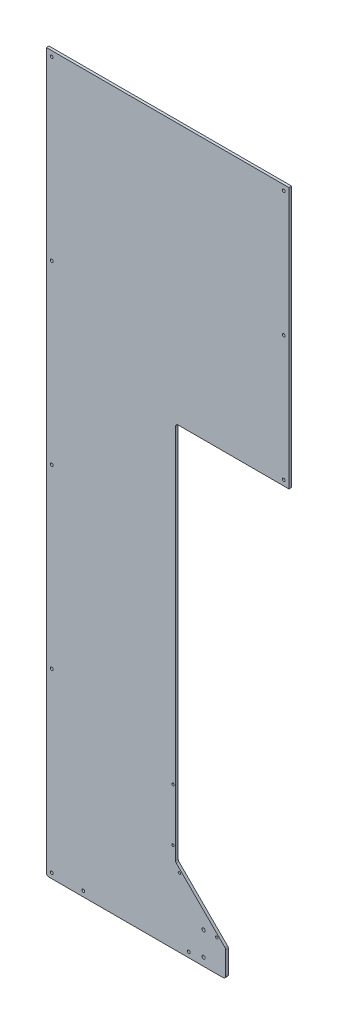
ISO-10303-21;
HEADER;
FILE_DESCRIPTION(('STEP AP214'),'2;1');
FILE_NAME('part.step','',(''),(''),'','','');
FILE_SCHEMA(('AUTOMOTIVE_DESIGN { 1 0 10303 214 1 1 1 1 }'));
ENDSEC;
DATA;
#1=APPLICATION_CONTEXT('core data for automotive mechanical design processes');
#2=APPLICATION_PROTOCOL_DEFINITION('international standard','automotive_design',2000,#1);
#3=PRODUCT_CONTEXT('',#1,'mechanical');
#4=PRODUCT('Part','Part','',(#3));
#5=PRODUCT_RELATED_PRODUCT_CATEGORY('part','',(#4));
#6=PRODUCT_DEFINITION_FORMATION('','',#4);
#7=PRODUCT_DEFINITION_CONTEXT('part definition',#1,'design');
#8=PRODUCT_DEFINITION('design','',#6,#7);
#9=PRODUCT_DEFINITION_SHAPE('','',#8);
#10=(LENGTH_UNIT() NAMED_UNIT(*) SI_UNIT(.MILLI.,.METRE.));
#11=(NAMED_UNIT(*) PLANE_ANGLE_UNIT() SI_UNIT($,.RADIAN.));
#12=(NAMED_UNIT(*) SI_UNIT($,.STERADIAN.) SOLID_ANGLE_UNIT());
#13=UNCERTAINTY_MEASURE_WITH_UNIT(LENGTH_MEASURE(1.E-05),#10,'distance_accuracy_value','');
#14=(GEOMETRIC_REPRESENTATION_CONTEXT(3) GLOBAL_UNCERTAINTY_ASSIGNED_CONTEXT((#13)) GLOBAL_UNIT_ASSIGNED_CONTEXT((#10,
#11,#12)) REPRESENTATION_CONTEXT('',''));
#15=CARTESIAN_POINT('',(0.,0.,0.));
#16=DIRECTION('',(0.,0.,1.));
#17=DIRECTION('',(1.,0.,0.));
#18=AXIS2_PLACEMENT_3D('',#15,#16,#17);
#19=CARTESIAN_POINT('',(0.,0.,6.35));
#20=DIRECTION('',(1.,0.,0.));
#21=DIRECTION('',(0.,0.,-1.));
#22=AXIS2_PLACEMENT_3D('',#19,#20,#21);
#23=PLANE('',#22);
#24=DIRECTION('',(0.,-1.,0.));
#25=VECTOR('',#24,1.);
#26=CARTESIAN_POINT('',(0.,0.,0.));
#27=LINE('',#26,#25);
#28=CARTESIAN_POINT('',(0.,1727.2,0.));
#29=VERTEX_POINT('',#28);
#30=CARTESIAN_POINT('',(0.,6.35,0.));
#31=VERTEX_POINT('',#30);
#32=EDGE_CURVE('E148',#29,#31,#27,.T.);
#33=ORIENTED_EDGE('',*,*,#32,.T.);
#34=DIRECTION('',(0.,0.,-1.));
#35=VECTOR('',#34,1.);
#36=CARTESIAN_POINT('',(0.,6.35,6.35));
#37=LINE('',#36,#35);
#38=CARTESIAN_POINT('',(0.,6.35,6.35));
#39=VERTEX_POINT('',#38);
#40=EDGE_CURVE('E182',#31,#39,#37,.F.);
#41=ORIENTED_EDGE('',*,*,#40,.T.);
#42=DIRECTION('',(0.,-1.,0.));
#43=VECTOR('',#42,1.);
#44=CARTESIAN_POINT('',(0.,0.,6.35));
#45=LINE('',#44,#43);
#46=CARTESIAN_POINT('',(0.,1727.2,6.35));
#47=VERTEX_POINT('',#46);
#48=EDGE_CURVE('E158',#47,#39,#45,.T.);
#49=ORIENTED_EDGE('',*,*,#48,.F.);
#50=DIRECTION('',(0.,0.,-1.));
#51=VECTOR('',#50,1.);
#52=CARTESIAN_POINT('',(0.,1727.2,6.35));
#53=LINE('',#52,#51);
#54=EDGE_CURVE('E164',#47,#29,#53,.T.);
#55=ORIENTED_EDGE('',*,*,#54,.T.);
#56=EDGE_LOOP('',(#33,#41,#49,#55));
#57=FACE_BOUND('',#56,.T.);
#58=ADVANCED_FACE('F35',(#57),#23,.F.);
#59=CARTESIAN_POINT('',(0.,0.,6.35));
#60=DIRECTION('',(0.,1.,0.));
#61=DIRECTION('',(0.,0.,1.));
#62=AXIS2_PLACEMENT_3D('',#59,#60,#61);
#63=PLANE('',#62);
#64=DIRECTION('',(1.,0.,0.));
#65=VECTOR('',#64,1.);
#66=CARTESIAN_POINT('',(0.,0.,6.35));
#67=LINE('',#66,#65);
#68=CARTESIAN_POINT('',(6.35,0.,6.35));
#69=VERTEX_POINT('',#68);
#70=CARTESIAN_POINT('',(425.45,0.,6.35));
#71=VERTEX_POINT('',#70);
#72=EDGE_CURVE('E292',#69,#71,#67,.T.);
#73=ORIENTED_EDGE('',*,*,#72,.F.);
#74=DIRECTION('',(0.,0.,-1.));
#75=VECTOR('',#74,1.);
#76=CARTESIAN_POINT('',(6.35,0.,6.35));
#77=LINE('',#76,#75);
#78=CARTESIAN_POINT('',(6.35,0.,0.));
#79=VERTEX_POINT('',#78);
#80=EDGE_CURVE('E173',#69,#79,#77,.T.);
#81=ORIENTED_EDGE('',*,*,#80,.T.);
#82=DIRECTION('',(1.,0.,0.));
#83=VECTOR('',#82,1.);
#84=CARTESIAN_POINT('',(0.,0.,0.));
#85=LINE('',#84,#83);
#86=CARTESIAN_POINT('',(425.45,0.,0.));
#87=VERTEX_POINT('',#86);
#88=EDGE_CURVE('E156',#79,#87,#85,.T.);
#89=ORIENTED_EDGE('',*,*,#88,.T.);
#90=DIRECTION('',(0.,0.,1.));
#91=VECTOR('',#90,1.);
#92=CARTESIAN_POINT('',(425.45,0.,6.35));
#93=LINE('',#92,#91);
#94=EDGE_CURVE('E170',#87,#71,#93,.T.);
#95=ORIENTED_EDGE('',*,*,#94,.T.);
#96=EDGE_LOOP('',(#73,#81,#89,#95));
#97=FACE_BOUND('',#96,.T.);
#98=ADVANCED_FACE('F308',(#97),#63,.F.);
#99=CARTESIAN_POINT('',(584.2,0.,6.35));
#100=DIRECTION('',(-1.,0.,0.));
#101=DIRECTION('',(0.,0.,1.));
#102=AXIS2_PLACEMENT_3D('',#99,#100,#101);
#103=PLANE('',#102);
#104=DIRECTION('',(0.,1.,0.));
#105=VECTOR('',#104,1.);
#106=CARTESIAN_POINT('',(584.2,0.,6.35));
#107=LINE('',#106,#105);
#108=CARTESIAN_POINT('',(584.2,1098.55,6.35));
#109=VERTEX_POINT('',#108);
#110=CARTESIAN_POINT('',(584.2,1727.2,6.35));
#111=VERTEX_POINT('',#110);
#112=EDGE_CURVE('E147',#109,#111,#107,.T.);
#113=ORIENTED_EDGE('',*,*,#112,.F.);
#114=DIRECTION('',(0.,0.,1.));
#115=VECTOR('',#114,1.);
#116=CARTESIAN_POINT('',(584.2,1098.55,0.));
#117=LINE('',#116,#115);
#118=CARTESIAN_POINT('',(584.2,1098.55,0.));
#119=VERTEX_POINT('',#118);
#120=EDGE_CURVE('E132',#119,#109,#117,.T.);
#121=ORIENTED_EDGE('',*,*,#120,.F.);
#122=DIRECTION('',(0.,1.,0.));
#123=VECTOR('',#122,1.);
#124=CARTESIAN_POINT('',(584.2,0.,0.));
#125=LINE('',#124,#123);
#126=CARTESIAN_POINT('',(584.2,1727.2,0.));
#127=VERTEX_POINT('',#126);
#128=EDGE_CURVE('E145',#119,#127,#125,.T.);
#129=ORIENTED_EDGE('',*,*,#128,.T.);
#130=DIRECTION('',(0.,0.,-1.));
#131=VECTOR('',#130,1.);
#132=CARTESIAN_POINT('',(584.2,1727.2,6.35));
#133=LINE('',#132,#131);
#134=EDGE_CURVE('E167',#111,#127,#133,.T.);
#135=ORIENTED_EDGE('',*,*,#134,.F.);
#136=EDGE_LOOP('',(#113,#121,#129,#135));
#137=FACE_BOUND('',#136,.T.);
#138=ADVANCED_FACE('F143',(#137),#103,.F.);
#139=CARTESIAN_POINT('',(0.,1727.2,6.35));
#140=DIRECTION('',(0.,-1.,0.));
#141=DIRECTION('',(0.,0.,-1.));
#142=AXIS2_PLACEMENT_3D('',#139,#140,#141);
#143=PLANE('',#142);
#144=DIRECTION('',(-1.,0.,0.));
#145=VECTOR('',#144,1.);
#146=CARTESIAN_POINT('',(0.,1727.2,0.));
#147=LINE('',#146,#145);
#148=EDGE_CURVE('E155',#127,#29,#147,.T.);
#149=ORIENTED_EDGE('',*,*,#148,.T.);
#150=ORIENTED_EDGE('',*,*,#54,.F.);
#151=DIRECTION('',(-1.,0.,0.));
#152=VECTOR('',#151,1.);
#153=CARTESIAN_POINT('',(0.,1727.2,6.35));
#154=LINE('',#153,#152);
#155=EDGE_CURVE('E168',#111,#47,#154,.T.);
#156=ORIENTED_EDGE('',*,*,#155,.F.);
#157=ORIENTED_EDGE('',*,*,#134,.T.);
#158=EDGE_LOOP('',(#149,#150,#156,#157));
#159=FACE_BOUND('',#158,.T.);
#160=ADVANCED_FACE('F477',(#159),#143,.F.);
#161=CARTESIAN_POINT('',(0.,0.,6.35));
#162=DIRECTION('',(0.,0.,-1.));
#163=DIRECTION('',(-1.,0.,0.));
#164=AXIS2_PLACEMENT_3D('',#161,#162,#163);
#165=PLANE('',#164);
#166=CARTESIAN_POINT('',(378.46762,19.0499999999997,6.35));
#167=DIRECTION('',(0.,0.,1.));
#168=DIRECTION('',(1.,0.,0.));
#169=AXIS2_PLACEMENT_3D('',#166,#167,#168);
#170=CIRCLE('',#169,3.937);
#171=CARTESIAN_POINT('',(382.40462,19.0499999999997,6.35));
#172=VERTEX_POINT('',#171);
#173=EDGE_CURVE('E704',#172,#172,#170,.T.);
#174=ORIENTED_EDGE('',*,*,#173,.F.);
#175=EDGE_LOOP('',(#174));
#176=FACE_BOUND('',#175,.T.);
#177=CARTESIAN_POINT('',(378.46762,76.1999999999997,6.35));
#178=DIRECTION('',(0.,0.,1.));
#179=DIRECTION('',(1.,0.,0.));
#180=AXIS2_PLACEMENT_3D('',#177,#178,#179);
#181=CIRCLE('',#180,3.937);
#182=CARTESIAN_POINT('',(382.40462,76.1999999999997,6.35));
#183=VERTEX_POINT('',#182);
#184=EDGE_CURVE('E710',#183,#183,#181,.T.);
#185=ORIENTED_EDGE('',*,*,#184,.F.);
#186=EDGE_LOOP('',(#185));
#187=FACE_BOUND('',#186,.T.);
#188=CARTESIAN_POINT('',(304.8,342.9,6.35));
#189=DIRECTION('',(0.,0.,-1.));
#190=DIRECTION('',(-1.,0.,0.));
#191=AXIS2_PLACEMENT_3D('',#188,#189,#190);
#192=CIRCLE('',#191,2.8067);
#193=CARTESIAN_POINT('',(301.9933,342.9,6.35));
#194=VERTEX_POINT('',#193);
#195=EDGE_CURVE('E720',#194,#194,#192,.T.);
#196=ORIENTED_EDGE('',*,*,#195,.T.);
#197=EDGE_LOOP('',(#196));
#198=FACE_BOUND('',#197,.T.);
#199=CARTESIAN_POINT('',(304.8,215.9,6.35));
#200=DIRECTION('',(0.,0.,-1.));
#201=DIRECTION('',(-1.,0.,0.));
#202=AXIS2_PLACEMENT_3D('',#199,#200,#201);
#203=CIRCLE('',#202,2.8067);
#204=CARTESIAN_POINT('',(301.9933,215.9,6.35));
#205=VERTEX_POINT('',#204);
#206=EDGE_CURVE('E729',#205,#205,#203,.T.);
#207=ORIENTED_EDGE('',*,*,#206,.T.);
#208=EDGE_LOOP('',(#207));
#209=FACE_BOUND('',#208,.T.);
#210=CARTESIAN_POINT('',(320.317182668239,166.002561210692,6.35));
#211=DIRECTION('',(0.,0.,-1.));
#212=DIRECTION('',(-1.,0.,0.));
#213=AXIS2_PLACEMENT_3D('',#210,#211,#212);
#214=CIRCLE('',#213,2.8067);
#215=CARTESIAN_POINT('',(317.510482668239,166.002561210692,6.35));
#216=VERTEX_POINT('',#215);
#217=EDGE_CURVE('E738',#216,#216,#214,.T.);
#218=ORIENTED_EDGE('',*,*,#217,.T.);
#219=EDGE_LOOP('',(#218));
#220=FACE_BOUND('',#219,.T.);
#221=CARTESIAN_POINT('',(410.11974387893,76.2,6.35));
#222=DIRECTION('',(0.,0.,-1.));
#223=DIRECTION('',(-1.,0.,0.));
#224=AXIS2_PLACEMENT_3D('',#221,#222,#223);
#225=CIRCLE('',#224,2.8067);
#226=CARTESIAN_POINT('',(407.31304387893,76.2,6.35));
#227=VERTEX_POINT('',#226);
#228=EDGE_CURVE('E222',#227,#227,#225,.T.);
#229=ORIENTED_EDGE('',*,*,#228,.T.);
#230=EDGE_LOOP('',(#229));
#231=FACE_BOUND('',#230,.T.);
#232=CARTESIAN_POINT('',(88.9,12.7,6.35));
#233=DIRECTION('',(0.,0.,1.));
#234=DIRECTION('',(1.,0.,0.));
#235=AXIS2_PLACEMENT_3D('',#232,#233,#234);
#236=CIRCLE('',#235,3.37819999999999);
#237=CARTESIAN_POINT('',(92.2782,12.7,6.35));
#238=VERTEX_POINT('',#237);
#239=EDGE_CURVE('E211',#238,#238,#236,.T.);
#240=ORIENTED_EDGE('',*,*,#239,.F.);
#241=EDGE_LOOP('',(#240));
#242=FACE_BOUND('',#241,.T.);
#243=CARTESIAN_POINT('',(342.9,12.7,6.35));
#244=DIRECTION('',(0.,0.,1.));
#245=DIRECTION('',(1.,0.,0.));
#246=AXIS2_PLACEMENT_3D('',#243,#244,#245);
#247=CIRCLE('',#246,3.37819999999999);
#248=CARTESIAN_POINT('',(346.2782,12.7,6.35));
#249=VERTEX_POINT('',#248);
#250=EDGE_CURVE('E217',#249,#249,#247,.T.);
#251=ORIENTED_EDGE('',*,*,#250,.F.);
#252=EDGE_LOOP('',(#251));
#253=FACE_BOUND('',#252,.T.);
#254=CARTESIAN_POINT('',(12.7,1714.5,6.35));
#255=DIRECTION('',(0.,0.,1.));
#256=DIRECTION('',(1.,0.,0.));
#257=AXIS2_PLACEMENT_3D('',#254,#255,#256);
#258=CIRCLE('',#257,3.37819999999999);
#259=CARTESIAN_POINT('',(16.0782,1714.5,6.35));
#260=VERTEX_POINT('',#259);
#261=EDGE_CURVE('E215',#260,#260,#258,.T.);
#262=ORIENTED_EDGE('',*,*,#261,.F.);
#263=EDGE_LOOP('',(#262));
#264=FACE_BOUND('',#263,.T.);
#265=CARTESIAN_POINT('',(12.7,1289.05,6.35));
#266=DIRECTION('',(0.,0.,1.));
#267=DIRECTION('',(1.,0.,0.));
#268=AXIS2_PLACEMENT_3D('',#265,#266,#267);
#269=CIRCLE('',#268,3.37819999999999);
#270=CARTESIAN_POINT('',(16.0782,1289.05,6.35));
#271=VERTEX_POINT('',#270);
#272=EDGE_CURVE('E232',#271,#271,#269,.T.);
#273=ORIENTED_EDGE('',*,*,#272,.F.);
#274=EDGE_LOOP('',(#273));
#275=FACE_BOUND('',#274,.T.);
#276=CARTESIAN_POINT('',(12.7,863.6,6.35));
#277=DIRECTION('',(0.,0.,1.));
#278=DIRECTION('',(1.,0.,0.));
#279=AXIS2_PLACEMENT_3D('',#276,#277,#278);
#280=CIRCLE('',#279,3.37819999999999);
#281=CARTESIAN_POINT('',(16.0782,863.6,6.35));
#282=VERTEX_POINT('',#281);
#283=EDGE_CURVE('E238',#282,#282,#280,.T.);
#284=ORIENTED_EDGE('',*,*,#283,.F.);
#285=EDGE_LOOP('',(#284));
#286=FACE_BOUND('',#285,.T.);
#287=CARTESIAN_POINT('',(12.7,438.15,6.35));
#288=DIRECTION('',(0.,0.,1.));
#289=DIRECTION('',(1.,0.,0.));
#290=AXIS2_PLACEMENT_3D('',#287,#288,#289);
#291=CIRCLE('',#290,3.37819999999999);
#292=CARTESIAN_POINT('',(16.0782,438.15,6.35));
#293=VERTEX_POINT('',#292);
#294=EDGE_CURVE('E244',#293,#293,#291,.T.);
#295=ORIENTED_EDGE('',*,*,#294,.F.);
#296=EDGE_LOOP('',(#295));
#297=FACE_BOUND('',#296,.T.);
#298=CARTESIAN_POINT('',(12.7,12.7,6.35));
#299=DIRECTION('',(0.,0.,1.));
#300=DIRECTION('',(1.,0.,0.));
#301=AXIS2_PLACEMENT_3D('',#298,#299,#300);
#302=CIRCLE('',#301,3.37819999999999);
#303=CARTESIAN_POINT('',(16.0782,12.7,6.35));
#304=VERTEX_POINT('',#303);
#305=EDGE_CURVE('E250',#304,#304,#302,.T.);
#306=ORIENTED_EDGE('',*,*,#305,.F.);
#307=EDGE_LOOP('',(#306));
#308=FACE_BOUND('',#307,.T.);
#309=CARTESIAN_POINT('',(571.5,1111.25,6.35));
#310=DIRECTION('',(0.,0.,1.));
#311=DIRECTION('',(1.,0.,0.));
#312=AXIS2_PLACEMENT_3D('',#309,#310,#311);
#313=CIRCLE('',#312,3.3782);
#314=CARTESIAN_POINT('',(574.8782,1111.25,6.35));
#315=VERTEX_POINT('',#314);
#316=EDGE_CURVE('E256',#315,#315,#313,.T.);
#317=ORIENTED_EDGE('',*,*,#316,.F.);
#318=EDGE_LOOP('',(#317));
#319=FACE_BOUND('',#318,.T.);
#320=CARTESIAN_POINT('',(571.5,1412.875,6.35));
#321=DIRECTION('',(0.,0.,1.));
#322=DIRECTION('',(1.,0.,0.));
#323=AXIS2_PLACEMENT_3D('',#320,#321,#322);
#324=CIRCLE('',#323,3.3782);
#325=CARTESIAN_POINT('',(574.8782,1412.875,6.35));
#326=VERTEX_POINT('',#325);
#327=EDGE_CURVE('E262',#326,#326,#324,.T.);
#328=ORIENTED_EDGE('',*,*,#327,.F.);
#329=EDGE_LOOP('',(#328));
#330=FACE_BOUND('',#329,.T.);
#331=CARTESIAN_POINT('',(571.5,1714.5,6.35));
#332=DIRECTION('',(0.,0.,1.));
#333=DIRECTION('',(1.,0.,0.));
#334=AXIS2_PLACEMENT_3D('',#331,#332,#333);
#335=CIRCLE('',#334,3.3782);
#336=CARTESIAN_POINT('',(574.8782,1714.5,6.35));
#337=VERTEX_POINT('',#336);
#338=EDGE_CURVE('E268',#337,#337,#335,.T.);
#339=ORIENTED_EDGE('',*,*,#338,.F.);
#340=EDGE_LOOP('',(#339));
#341=FACE_BOUND('',#340,.T.);
#342=ORIENTED_EDGE('',*,*,#48,.T.);
#343=CARTESIAN_POINT('',(6.35,6.35,6.35));
#344=DIRECTION('',(0.,0.,-1.));
#345=DIRECTION('',(-1.,0.,0.));
#346=AXIS2_PLACEMENT_3D('',#343,#344,#345);
#347=CIRCLE('',#346,6.35);
#348=EDGE_CURVE('E188',#39,#69,#347,.F.);
#349=ORIENTED_EDGE('',*,*,#348,.T.);
#350=ORIENTED_EDGE('',*,*,#72,.T.);
#351=CARTESIAN_POINT('',(425.45,6.35,6.35));
#352=DIRECTION('',(0.,0.,-1.));
#353=DIRECTION('',(-1.,0.,0.));
#354=AXIS2_PLACEMENT_3D('',#351,#352,#353);
#355=CIRCLE('',#354,6.35);
#356=CARTESIAN_POINT('',(431.8,6.35,6.35));
#357=VERTEX_POINT('',#356);
#358=EDGE_CURVE('E186',#71,#357,#355,.F.);
#359=ORIENTED_EDGE('',*,*,#358,.T.);
#360=DIRECTION('',(0.,-1.,0.));
#361=VECTOR('',#360,1.);
#362=CARTESIAN_POINT('',(431.8,63.5,6.35));
#363=LINE('',#362,#361);
#364=CARTESIAN_POINT('',(431.8,60.8697438789308,6.35));
#365=VERTEX_POINT('',#364);
#366=EDGE_CURVE('E139',#365,#357,#363,.T.);
#367=ORIENTED_EDGE('',*,*,#366,.F.);
#368=CARTESIAN_POINT('',(425.45,60.8697438789308,6.35));
#369=DIRECTION('',(0.,0.,-1.));
#370=DIRECTION('',(-1.,0.,0.));
#371=AXIS2_PLACEMENT_3D('',#368,#369,#370);
#372=CIRCLE('',#371,6.35);
#373=CARTESIAN_POINT('',(429.940128060535,65.3598719394654,6.35));
#374=VERTEX_POINT('',#373);
#375=EDGE_CURVE('E184',#365,#374,#372,.F.);
#376=ORIENTED_EDGE('',*,*,#375,.T.);
#377=DIRECTION('',(0.70710678118655,-0.707106781186545,0.));
#378=VECTOR('',#377,1.);
#379=CARTESIAN_POINT('',(311.15,184.149999999999,6.35));
#380=LINE('',#379,#378);
#381=CARTESIAN_POINT('',(313.009871939466,182.290128060534,6.35));
#382=VERTEX_POINT('',#381);
#383=EDGE_CURVE('E285',#382,#374,#380,.T.);
#384=ORIENTED_EDGE('',*,*,#383,.F.);
#385=CARTESIAN_POINT('',(317.5,186.780256121068,6.35));
#386=DIRECTION('',(0.,0.,-1.));
#387=DIRECTION('',(-1.,0.,0.));
#388=AXIS2_PLACEMENT_3D('',#385,#386,#387);
#389=CIRCLE('',#388,6.35);
#390=CARTESIAN_POINT('',(311.15,186.780256121068,6.35));
#391=VERTEX_POINT('',#390);
#392=EDGE_CURVE('E57',#382,#391,#389,.T.);
#393=ORIENTED_EDGE('',*,*,#392,.T.);
#394=DIRECTION('',(0.,-1.,0.));
#395=VECTOR('',#394,1.);
#396=CARTESIAN_POINT('',(311.15,1098.55,6.35));
#397=LINE('',#396,#395);
#398=CARTESIAN_POINT('',(311.15,1092.2,6.35));
#399=VERTEX_POINT('',#398);
#400=EDGE_CURVE('E283',#399,#391,#397,.T.);
#401=ORIENTED_EDGE('',*,*,#400,.F.);
#402=CARTESIAN_POINT('',(317.5,1092.2,6.35));
#403=DIRECTION('',(0.,0.,-1.));
#404=DIRECTION('',(-1.,0.,0.));
#405=AXIS2_PLACEMENT_3D('',#402,#403,#404);
#406=CIRCLE('',#405,6.35);
#407=CARTESIAN_POINT('',(317.5,1098.55,6.35));
#408=VERTEX_POINT('',#407);
#409=EDGE_CURVE('E44',#399,#408,#406,.T.);
#410=ORIENTED_EDGE('',*,*,#409,.T.);
#411=DIRECTION('',(-1.,0.,0.));
#412=VECTOR('',#411,1.);
#413=CARTESIAN_POINT('',(584.2,1098.55,6.35));
#414=LINE('',#413,#412);
#415=EDGE_CURVE('E273',#109,#408,#414,.T.);
#416=ORIENTED_EDGE('',*,*,#415,.F.);
#417=ORIENTED_EDGE('',*,*,#112,.T.);
#418=ORIENTED_EDGE('',*,*,#155,.T.);
#419=EDGE_LOOP('',(#342,#349,#350,#359,#367,#376,#384,#393,#401,#410,#416,#417,#418));
#420=FACE_BOUND('',#419,.T.);
#421=ADVANCED_FACE('F306',(#176,#187,#198,#209,#220,#231,#242,#253,#264,#275,#286,#297,#308,
#319,#330,#341,#420),#165,.F.);
#422=CARTESIAN_POINT('',(0.,0.,0.));
#423=DIRECTION('',(0.,0.,-1.));
#424=DIRECTION('',(-1.,0.,0.));
#425=AXIS2_PLACEMENT_3D('',#422,#423,#424);
#426=PLANE('',#425);
#427=CARTESIAN_POINT('',(378.46762,19.0499999999997,0.));
#428=DIRECTION('',(0.,0.,1.));
#429=DIRECTION('',(1.,0.,0.));
#430=AXIS2_PLACEMENT_3D('',#427,#428,#429);
#431=CIRCLE('',#430,3.937);
#432=CARTESIAN_POINT('',(382.40462,19.0499999999997,0.));
#433=VERTEX_POINT('',#432);
#434=EDGE_CURVE('E701',#433,#433,#431,.T.);
#435=ORIENTED_EDGE('',*,*,#434,.T.);
#436=EDGE_LOOP('',(#435));
#437=FACE_BOUND('',#436,.T.);
#438=CARTESIAN_POINT('',(378.46762,76.1999999999997,0.));
#439=DIRECTION('',(0.,0.,1.));
#440=DIRECTION('',(1.,0.,0.));
#441=AXIS2_PLACEMENT_3D('',#438,#439,#440);
#442=CIRCLE('',#441,3.937);
#443=CARTESIAN_POINT('',(382.40462,76.1999999999997,0.));
#444=VERTEX_POINT('',#443);
#445=EDGE_CURVE('E705',#444,#444,#442,.T.);
#446=ORIENTED_EDGE('',*,*,#445,.T.);
#447=EDGE_LOOP('',(#446));
#448=FACE_BOUND('',#447,.T.);
#449=CARTESIAN_POINT('',(304.8,342.9,0.));
#450=DIRECTION('',(0.,0.,-1.));
#451=DIRECTION('',(-1.,0.,0.));
#452=AXIS2_PLACEMENT_3D('',#449,#450,#451);
#453=CIRCLE('',#452,4.88949999999999);
#454=CARTESIAN_POINT('',(299.9105,342.9,0.));
#455=VERTEX_POINT('',#454);
#456=EDGE_CURVE('E707',#455,#455,#453,.T.);
#457=ORIENTED_EDGE('',*,*,#456,.F.);
#458=EDGE_LOOP('',(#457));
#459=FACE_BOUND('',#458,.T.);
#460=CARTESIAN_POINT('',(304.8,215.9,0.));
#461=DIRECTION('',(0.,0.,-1.));
#462=DIRECTION('',(-1.,0.,0.));
#463=AXIS2_PLACEMENT_3D('',#460,#461,#462);
#464=CIRCLE('',#463,4.88949999999999);
#465=CARTESIAN_POINT('',(299.9105,215.9,0.));
#466=VERTEX_POINT('',#465);
#467=EDGE_CURVE('E723',#466,#466,#464,.T.);
#468=ORIENTED_EDGE('',*,*,#467,.F.);
#469=EDGE_LOOP('',(#468));
#470=FACE_BOUND('',#469,.T.);
#471=CARTESIAN_POINT('',(320.317182668239,166.002561210692,0.));
#472=DIRECTION('',(0.,0.,-1.));
#473=DIRECTION('',(-1.,0.,0.));
#474=AXIS2_PLACEMENT_3D('',#471,#472,#473);
#475=CIRCLE('',#474,4.88949999999999);
#476=CARTESIAN_POINT('',(315.427682668239,166.002561210692,0.));
#477=VERTEX_POINT('',#476);
#478=EDGE_CURVE('E732',#477,#477,#475,.T.);
#479=ORIENTED_EDGE('',*,*,#478,.F.);
#480=EDGE_LOOP('',(#479));
#481=FACE_BOUND('',#480,.T.);
#482=CARTESIAN_POINT('',(410.11974387893,76.2,0.));
#483=DIRECTION('',(0.,0.,-1.));
#484=DIRECTION('',(-1.,0.,0.));
#485=AXIS2_PLACEMENT_3D('',#482,#483,#484);
#486=CIRCLE('',#485,4.88949999999999);
#487=CARTESIAN_POINT('',(405.23024387893,76.2,0.));
#488=VERTEX_POINT('',#487);
#489=EDGE_CURVE('E741',#488,#488,#486,.T.);
#490=ORIENTED_EDGE('',*,*,#489,.F.);
#491=EDGE_LOOP('',(#490));
#492=FACE_BOUND('',#491,.T.);
#493=CARTESIAN_POINT('',(88.9,12.7,0.));
#494=DIRECTION('',(0.,0.,-1.));
#495=DIRECTION('',(-1.,0.,0.));
#496=AXIS2_PLACEMENT_3D('',#493,#494,#495);
#497=CIRCLE('',#496,3.37819999999999);
#498=CARTESIAN_POINT('',(85.5218,12.7,0.));
#499=VERTEX_POINT('',#498);
#500=EDGE_CURVE('E39',#499,#499,#497,.T.);
#501=ORIENTED_EDGE('',*,*,#500,.F.);
#502=EDGE_LOOP('',(#501));
#503=FACE_BOUND('',#502,.T.);
#504=CARTESIAN_POINT('',(342.9,12.7,0.));
#505=DIRECTION('',(0.,0.,-1.));
#506=DIRECTION('',(-1.,0.,0.));
#507=AXIS2_PLACEMENT_3D('',#504,#505,#506);
#508=CIRCLE('',#507,3.37819999999999);
#509=CARTESIAN_POINT('',(339.5218,12.7,0.));
#510=VERTEX_POINT('',#509);
#511=EDGE_CURVE('E209',#510,#510,#508,.T.);
#512=ORIENTED_EDGE('',*,*,#511,.F.);
#513=EDGE_LOOP('',(#512));
#514=FACE_BOUND('',#513,.T.);
#515=CARTESIAN_POINT('',(12.7,1714.5,0.));
#516=DIRECTION('',(0.,0.,1.));
#517=DIRECTION('',(1.,0.,0.));
#518=AXIS2_PLACEMENT_3D('',#515,#516,#517);
#519=CIRCLE('',#518,3.37819999999999);
#520=CARTESIAN_POINT('',(16.0782,1714.5,0.));
#521=VERTEX_POINT('',#520);
#522=EDGE_CURVE('E229',#521,#521,#519,.T.);
#523=ORIENTED_EDGE('',*,*,#522,.T.);
#524=EDGE_LOOP('',(#523));
#525=FACE_BOUND('',#524,.T.);
#526=CARTESIAN_POINT('',(12.7,1289.05,0.));
#527=DIRECTION('',(0.,0.,1.));
#528=DIRECTION('',(1.,0.,0.));
#529=AXIS2_PLACEMENT_3D('',#526,#527,#528);
#530=CIRCLE('',#529,3.37819999999999);
#531=CARTESIAN_POINT('',(16.0782,1289.05,0.));
#532=VERTEX_POINT('',#531);
#533=EDGE_CURVE('E235',#532,#532,#530,.T.);
#534=ORIENTED_EDGE('',*,*,#533,.T.);
#535=EDGE_LOOP('',(#534));
#536=FACE_BOUND('',#535,.T.);
#537=CARTESIAN_POINT('',(12.7,863.6,0.));
#538=DIRECTION('',(0.,0.,1.));
#539=DIRECTION('',(1.,0.,0.));
#540=AXIS2_PLACEMENT_3D('',#537,#538,#539);
#541=CIRCLE('',#540,3.37819999999999);
#542=CARTESIAN_POINT('',(16.0782,863.6,0.));
#543=VERTEX_POINT('',#542);
#544=EDGE_CURVE('E241',#543,#543,#541,.T.);
#545=ORIENTED_EDGE('',*,*,#544,.T.);
#546=EDGE_LOOP('',(#545));
#547=FACE_BOUND('',#546,.T.);
#548=CARTESIAN_POINT('',(12.7,438.15,0.));
#549=DIRECTION('',(0.,0.,1.));
#550=DIRECTION('',(1.,0.,0.));
#551=AXIS2_PLACEMENT_3D('',#548,#549,#550);
#552=CIRCLE('',#551,3.37819999999999);
#553=CARTESIAN_POINT('',(16.0782,438.15,0.));
#554=VERTEX_POINT('',#553);
#555=EDGE_CURVE('E247',#554,#554,#552,.T.);
#556=ORIENTED_EDGE('',*,*,#555,.T.);
#557=EDGE_LOOP('',(#556));
#558=FACE_BOUND('',#557,.T.);
#559=CARTESIAN_POINT('',(12.7,12.7,0.));
#560=DIRECTION('',(0.,0.,1.));
#561=DIRECTION('',(1.,0.,0.));
#562=AXIS2_PLACEMENT_3D('',#559,#560,#561);
#563=CIRCLE('',#562,3.37819999999999);
#564=CARTESIAN_POINT('',(16.0782,12.7,0.));
#565=VERTEX_POINT('',#564);
#566=EDGE_CURVE('E253',#565,#565,#563,.T.);
#567=ORIENTED_EDGE('',*,*,#566,.T.);
#568=EDGE_LOOP('',(#567));
#569=FACE_BOUND('',#568,.T.);
#570=CARTESIAN_POINT('',(571.5,1111.25,0.));
#571=DIRECTION('',(0.,0.,1.));
#572=DIRECTION('',(1.,0.,0.));
#573=AXIS2_PLACEMENT_3D('',#570,#571,#572);
#574=CIRCLE('',#573,3.3782);
#575=CARTESIAN_POINT('',(574.8782,1111.25,0.));
#576=VERTEX_POINT('',#575);
#577=EDGE_CURVE('E259',#576,#576,#574,.T.);
#578=ORIENTED_EDGE('',*,*,#577,.T.);
#579=EDGE_LOOP('',(#578));
#580=FACE_BOUND('',#579,.T.);
#581=CARTESIAN_POINT('',(571.5,1412.875,0.));
#582=DIRECTION('',(0.,0.,1.));
#583=DIRECTION('',(1.,0.,0.));
#584=AXIS2_PLACEMENT_3D('',#581,#582,#583);
#585=CIRCLE('',#584,3.3782);
#586=CARTESIAN_POINT('',(574.8782,1412.875,0.));
#587=VERTEX_POINT('',#586);
#588=EDGE_CURVE('E265',#587,#587,#585,.T.);
#589=ORIENTED_EDGE('',*,*,#588,.T.);
#590=EDGE_LOOP('',(#589));
#591=FACE_BOUND('',#590,.T.);
#592=CARTESIAN_POINT('',(571.5,1714.5,0.));
#593=DIRECTION('',(0.,0.,1.));
#594=DIRECTION('',(1.,0.,0.));
#595=AXIS2_PLACEMENT_3D('',#592,#593,#594);
#596=CIRCLE('',#595,3.3782);
#597=CARTESIAN_POINT('',(574.8782,1714.5,0.));
#598=VERTEX_POINT('',#597);
#599=EDGE_CURVE('E271',#598,#598,#596,.T.);
#600=ORIENTED_EDGE('',*,*,#599,.T.);
#601=EDGE_LOOP('',(#600));
#602=FACE_BOUND('',#601,.T.);
#603=ORIENTED_EDGE('',*,*,#88,.F.);
#604=CARTESIAN_POINT('',(6.35,6.35,0.));
#605=DIRECTION('',(0.,0.,-1.));
#606=DIRECTION('',(-1.,0.,0.));
#607=AXIS2_PLACEMENT_3D('',#604,#605,#606);
#608=CIRCLE('',#607,6.35);
#609=EDGE_CURVE('E180',#79,#31,#608,.T.);
#610=ORIENTED_EDGE('',*,*,#609,.T.);
#611=ORIENTED_EDGE('',*,*,#32,.F.);
#612=ORIENTED_EDGE('',*,*,#148,.F.);
#613=ORIENTED_EDGE('',*,*,#128,.F.);
#614=DIRECTION('',(-1.,0.,0.));
#615=VECTOR('',#614,1.);
#616=CARTESIAN_POINT('',(584.2,1098.55,0.));
#617=LINE('',#616,#615);
#618=CARTESIAN_POINT('',(317.5,1098.55,0.));
#619=VERTEX_POINT('',#618);
#620=EDGE_CURVE('E129',#119,#619,#617,.T.);
#621=ORIENTED_EDGE('',*,*,#620,.T.);
#622=CARTESIAN_POINT('',(317.5,1092.2,0.));
#623=DIRECTION('',(0.,0.,-1.));
#624=DIRECTION('',(-1.,0.,0.));
#625=AXIS2_PLACEMENT_3D('',#622,#623,#624);
#626=CIRCLE('',#625,6.35);
#627=CARTESIAN_POINT('',(311.15,1092.2,0.));
#628=VERTEX_POINT('',#627);
#629=EDGE_CURVE('E11',#619,#628,#626,.F.);
#630=ORIENTED_EDGE('',*,*,#629,.T.);
#631=DIRECTION('',(0.,-1.,0.));
#632=VECTOR('',#631,1.);
#633=CARTESIAN_POINT('',(311.15,1098.55,0.));
#634=LINE('',#633,#632);
#635=CARTESIAN_POINT('',(311.15,186.780256121068,0.));
#636=VERTEX_POINT('',#635);
#637=EDGE_CURVE('E138',#628,#636,#634,.T.);
#638=ORIENTED_EDGE('',*,*,#637,.T.);
#639=CARTESIAN_POINT('',(317.5,186.780256121068,0.));
#640=DIRECTION('',(0.,0.,-1.));
#641=DIRECTION('',(-1.,0.,0.));
#642=AXIS2_PLACEMENT_3D('',#639,#640,#641);
#643=CIRCLE('',#642,6.35);
#644=CARTESIAN_POINT('',(313.009871939466,182.290128060534,0.));
#645=VERTEX_POINT('',#644);
#646=EDGE_CURVE('E207',#636,#645,#643,.F.);
#647=ORIENTED_EDGE('',*,*,#646,.T.);
#648=DIRECTION('',(0.70710678118655,-0.707106781186545,0.));
#649=VECTOR('',#648,1.);
#650=CARTESIAN_POINT('',(311.15,184.149999999999,0.));
#651=LINE('',#650,#649);
#652=CARTESIAN_POINT('',(429.940128060535,65.3598719394654,0.));
#653=VERTEX_POINT('',#652);
#654=EDGE_CURVE('E277',#645,#653,#651,.T.);
#655=ORIENTED_EDGE('',*,*,#654,.T.);
#656=CARTESIAN_POINT('',(425.45,60.8697438789308,0.));
#657=DIRECTION('',(0.,0.,-1.));
#658=DIRECTION('',(-1.,0.,0.));
#659=AXIS2_PLACEMENT_3D('',#656,#657,#658);
#660=CIRCLE('',#659,6.35);
#661=CARTESIAN_POINT('',(431.8,60.8697438789308,0.));
#662=VERTEX_POINT('',#661);
#663=EDGE_CURVE('E176',#653,#662,#660,.T.);
#664=ORIENTED_EDGE('',*,*,#663,.T.);
#665=DIRECTION('',(0.,-1.,0.));
#666=VECTOR('',#665,1.);
#667=CARTESIAN_POINT('',(431.8,63.5,0.));
#668=LINE('',#667,#666);
#669=CARTESIAN_POINT('',(431.8,6.35,0.));
#670=VERTEX_POINT('',#669);
#671=EDGE_CURVE('E149',#662,#670,#668,.T.);
#672=ORIENTED_EDGE('',*,*,#671,.T.);
#673=CARTESIAN_POINT('',(425.45,6.35,0.));
#674=DIRECTION('',(0.,0.,-1.));
#675=DIRECTION('',(-1.,0.,0.));
#676=AXIS2_PLACEMENT_3D('',#673,#674,#675);
#677=CIRCLE('',#676,6.35);
#678=EDGE_CURVE('E178',#670,#87,#677,.T.);
#679=ORIENTED_EDGE('',*,*,#678,.T.);
#680=EDGE_LOOP('',(#603,#610,#611,#612,#613,#621,#630,#638,#647,#655,#664,#672,#679));
#681=FACE_BOUND('',#680,.T.);
#682=ADVANCED_FACE('F153',(#437,#448,#459,#470,#481,#492,#503,#514,#525,#536,#547,#558,#569,
#580,#591,#602,#681),#426,.T.);
#683=CARTESIAN_POINT('',(431.8,63.5,0.));
#684=DIRECTION('',(-1.,0.,0.));
#685=DIRECTION('',(0.,0.,1.));
#686=AXIS2_PLACEMENT_3D('',#683,#684,#685);
#687=PLANE('',#686);
#688=ORIENTED_EDGE('',*,*,#366,.T.);
#689=DIRECTION('',(0.,0.,1.));
#690=VECTOR('',#689,1.);
#691=CARTESIAN_POINT('',(431.8,6.35,0.));
#692=LINE('',#691,#690);
#693=EDGE_CURVE('E193',#357,#670,#692,.F.);
#694=ORIENTED_EDGE('',*,*,#693,.T.);
#695=ORIENTED_EDGE('',*,*,#671,.F.);
#696=DIRECTION('',(0.,0.,1.));
#697=VECTOR('',#696,1.);
#698=CARTESIAN_POINT('',(431.8,60.8697438789308,0.));
#699=LINE('',#698,#697);
#700=EDGE_CURVE('E190',#662,#365,#699,.T.);
#701=ORIENTED_EDGE('',*,*,#700,.T.);
#702=EDGE_LOOP('',(#688,#694,#695,#701));
#703=FACE_BOUND('',#702,.T.);
#704=ADVANCED_FACE('F316',(#703),#687,.F.);
#705=CARTESIAN_POINT('',(311.15,184.149999999999,0.));
#706=DIRECTION('',(-0.707106781186545,-0.707106781186549,0.));
#707=DIRECTION('',(0.70710678118655,-0.707106781186545,0.));
#708=AXIS2_PLACEMENT_3D('',#705,#706,#707);
#709=PLANE('',#708);
#710=ORIENTED_EDGE('',*,*,#383,.T.);
#711=DIRECTION('',(0.,0.,1.));
#712=VECTOR('',#711,1.);
#713=CARTESIAN_POINT('',(429.940128060535,65.3598719394654,0.));
#714=LINE('',#713,#712);
#715=EDGE_CURVE('E198',#374,#653,#714,.F.);
#716=ORIENTED_EDGE('',*,*,#715,.T.);
#717=ORIENTED_EDGE('',*,*,#654,.F.);
#718=DIRECTION('',(0.,0.,1.));
#719=VECTOR('',#718,1.);
#720=CARTESIAN_POINT('',(313.009871939466,182.290128060534,6.35));
#721=LINE('',#720,#719);
#722=EDGE_CURVE('E195',#645,#382,#721,.T.);
#723=ORIENTED_EDGE('',*,*,#722,.T.);
#724=EDGE_LOOP('',(#710,#716,#717,#723));
#725=FACE_BOUND('',#724,.T.);
#726=ADVANCED_FACE('F324',(#725),#709,.F.);
#727=CARTESIAN_POINT('',(311.15,1098.55,0.));
#728=DIRECTION('',(-1.,0.,0.));
#729=DIRECTION('',(0.,-1.,0.));
#730=AXIS2_PLACEMENT_3D('',#727,#728,#729);
#731=PLANE('',#730);
#732=ORIENTED_EDGE('',*,*,#400,.T.);
#733=DIRECTION('',(0.,0.,1.));
#734=VECTOR('',#733,1.);
#735=CARTESIAN_POINT('',(311.15,186.780256121068,0.));
#736=LINE('',#735,#734);
#737=EDGE_CURVE('E203',#391,#636,#736,.F.);
#738=ORIENTED_EDGE('',*,*,#737,.T.);
#739=ORIENTED_EDGE('',*,*,#637,.F.);
#740=DIRECTION('',(0.,0.,1.));
#741=VECTOR('',#740,1.);
#742=CARTESIAN_POINT('',(311.15,1092.2,6.35));
#743=LINE('',#742,#741);
#744=EDGE_CURVE('E200',#628,#399,#743,.T.);
#745=ORIENTED_EDGE('',*,*,#744,.T.);
#746=EDGE_LOOP('',(#732,#738,#739,#745));
#747=FACE_BOUND('',#746,.T.);
#748=ADVANCED_FACE('F333',(#747),#731,.F.);
#749=CARTESIAN_POINT('',(584.2,1098.55,0.));
#750=DIRECTION('',(0.,1.,0.));
#751=DIRECTION('',(0.,0.,1.));
#752=AXIS2_PLACEMENT_3D('',#749,#750,#751);
#753=PLANE('',#752);
#754=ORIENTED_EDGE('',*,*,#415,.T.);
#755=DIRECTION('',(0.,0.,1.));
#756=VECTOR('',#755,1.);
#757=CARTESIAN_POINT('',(317.5,1098.55,0.));
#758=LINE('',#757,#756);
#759=EDGE_CURVE('E134',#408,#619,#758,.F.);
#760=ORIENTED_EDGE('',*,*,#759,.T.);
#761=ORIENTED_EDGE('',*,*,#620,.F.);
#762=ORIENTED_EDGE('',*,*,#120,.T.);
#763=EDGE_LOOP('',(#754,#760,#761,#762));
#764=FACE_BOUND('',#763,.T.);
#765=ADVANCED_FACE('F131',(#764),#753,.F.);
#766=CARTESIAN_POINT('',(571.5,1714.5,6.35));
#767=DIRECTION('',(0.,0.,1.));
#768=DIRECTION('',(1.,0.,0.));
#769=AXIS2_PLACEMENT_3D('',#766,#767,#768);
#770=CYLINDRICAL_SURFACE('',#769,3.3782);
#771=ORIENTED_EDGE('',*,*,#599,.F.);
#772=EDGE_LOOP('',(#771));
#773=FACE_BOUND('',#772,.T.);
#774=ORIENTED_EDGE('',*,*,#338,.T.);
#775=EDGE_LOOP('',(#774));
#776=FACE_BOUND('',#775,.T.);
#777=ADVANCED_FACE('F541',(#773,#776),#770,.F.);
#778=CARTESIAN_POINT('',(571.5,1412.875,6.35));
#779=DIRECTION('',(0.,0.,1.));
#780=DIRECTION('',(1.,0.,0.));
#781=AXIS2_PLACEMENT_3D('',#778,#779,#780);
#782=CYLINDRICAL_SURFACE('',#781,3.3782);
#783=ORIENTED_EDGE('',*,*,#588,.F.);
#784=EDGE_LOOP('',(#783));
#785=FACE_BOUND('',#784,.T.);
#786=ORIENTED_EDGE('',*,*,#327,.T.);
#787=EDGE_LOOP('',(#786));
#788=FACE_BOUND('',#787,.T.);
#789=ADVANCED_FACE('F537',(#785,#788),#782,.F.);
#790=CARTESIAN_POINT('',(571.5,1111.25,6.35));
#791=DIRECTION('',(0.,0.,1.));
#792=DIRECTION('',(1.,0.,0.));
#793=AXIS2_PLACEMENT_3D('',#790,#791,#792);
#794=CYLINDRICAL_SURFACE('',#793,3.3782);
#795=ORIENTED_EDGE('',*,*,#577,.F.);
#796=EDGE_LOOP('',(#795));
#797=FACE_BOUND('',#796,.T.);
#798=ORIENTED_EDGE('',*,*,#316,.T.);
#799=EDGE_LOOP('',(#798));
#800=FACE_BOUND('',#799,.T.);
#801=ADVANCED_FACE('F533',(#797,#800),#794,.F.);
#802=CARTESIAN_POINT('',(12.7,12.7,6.35));
#803=DIRECTION('',(0.,0.,1.));
#804=DIRECTION('',(1.,0.,0.));
#805=AXIS2_PLACEMENT_3D('',#802,#803,#804);
#806=CYLINDRICAL_SURFACE('',#805,3.37819999999999);
#807=ORIENTED_EDGE('',*,*,#566,.F.);
#808=EDGE_LOOP('',(#807));
#809=FACE_BOUND('',#808,.T.);
#810=ORIENTED_EDGE('',*,*,#305,.T.);
#811=EDGE_LOOP('',(#810));
#812=FACE_BOUND('',#811,.T.);
#813=ADVANCED_FACE('F529',(#809,#812),#806,.F.);
#814=CARTESIAN_POINT('',(12.7,438.15,6.35));
#815=DIRECTION('',(0.,0.,1.));
#816=DIRECTION('',(1.,0.,0.));
#817=AXIS2_PLACEMENT_3D('',#814,#815,#816);
#818=CYLINDRICAL_SURFACE('',#817,3.37819999999999);
#819=ORIENTED_EDGE('',*,*,#555,.F.);
#820=EDGE_LOOP('',(#819));
#821=FACE_BOUND('',#820,.T.);
#822=ORIENTED_EDGE('',*,*,#294,.T.);
#823=EDGE_LOOP('',(#822));
#824=FACE_BOUND('',#823,.T.);
#825=ADVANCED_FACE('F525',(#821,#824),#818,.F.);
#826=CARTESIAN_POINT('',(12.7,863.6,6.35));
#827=DIRECTION('',(0.,0.,1.));
#828=DIRECTION('',(1.,0.,0.));
#829=AXIS2_PLACEMENT_3D('',#826,#827,#828);
#830=CYLINDRICAL_SURFACE('',#829,3.37819999999999);
#831=ORIENTED_EDGE('',*,*,#544,.F.);
#832=EDGE_LOOP('',(#831));
#833=FACE_BOUND('',#832,.T.);
#834=ORIENTED_EDGE('',*,*,#283,.T.);
#835=EDGE_LOOP('',(#834));
#836=FACE_BOUND('',#835,.T.);
#837=ADVANCED_FACE('F521',(#833,#836),#830,.F.);
#838=CARTESIAN_POINT('',(12.7,1289.05,6.35));
#839=DIRECTION('',(0.,0.,1.));
#840=DIRECTION('',(1.,0.,0.));
#841=AXIS2_PLACEMENT_3D('',#838,#839,#840);
#842=CYLINDRICAL_SURFACE('',#841,3.37819999999999);
#843=ORIENTED_EDGE('',*,*,#533,.F.);
#844=EDGE_LOOP('',(#843));
#845=FACE_BOUND('',#844,.T.);
#846=ORIENTED_EDGE('',*,*,#272,.T.);
#847=EDGE_LOOP('',(#846));
#848=FACE_BOUND('',#847,.T.);
#849=ADVANCED_FACE('F517',(#845,#848),#842,.F.);
#850=CARTESIAN_POINT('',(12.7,1714.5,6.35));
#851=DIRECTION('',(0.,0.,1.));
#852=DIRECTION('',(1.,0.,0.));
#853=AXIS2_PLACEMENT_3D('',#850,#851,#852);
#854=CYLINDRICAL_SURFACE('',#853,3.37819999999999);
#855=ORIENTED_EDGE('',*,*,#522,.F.);
#856=EDGE_LOOP('',(#855));
#857=FACE_BOUND('',#856,.T.);
#858=ORIENTED_EDGE('',*,*,#261,.T.);
#859=EDGE_LOOP('',(#858));
#860=FACE_BOUND('',#859,.T.);
#861=ADVANCED_FACE('F354',(#857,#860),#854,.F.);
#862=CARTESIAN_POINT('',(6.35,6.35,6.35));
#863=DIRECTION('',(0.,0.,-1.));
#864=DIRECTION('',(-1.,0.,0.));
#865=AXIS2_PLACEMENT_3D('',#862,#863,#864);
#866=CYLINDRICAL_SURFACE('',#865,6.35);
#867=ORIENTED_EDGE('',*,*,#348,.F.);
#868=ORIENTED_EDGE('',*,*,#40,.F.);
#869=ORIENTED_EDGE('',*,*,#609,.F.);
#870=ORIENTED_EDGE('',*,*,#80,.F.);
#871=EDGE_LOOP('',(#867,#868,#869,#870));
#872=FACE_BOUND('',#871,.T.);
#873=ADVANCED_FACE('F303',(#872),#866,.T.);
#874=CARTESIAN_POINT('',(425.45,6.35,6.35));
#875=DIRECTION('',(0.,0.,1.));
#876=DIRECTION('',(1.,0.,0.));
#877=AXIS2_PLACEMENT_3D('',#874,#875,#876);
#878=CYLINDRICAL_SURFACE('',#877,6.35);
#879=ORIENTED_EDGE('',*,*,#678,.F.);
#880=ORIENTED_EDGE('',*,*,#693,.F.);
#881=ORIENTED_EDGE('',*,*,#358,.F.);
#882=ORIENTED_EDGE('',*,*,#94,.F.);
#883=EDGE_LOOP('',(#879,#880,#881,#882));
#884=FACE_BOUND('',#883,.T.);
#885=ADVANCED_FACE('F312',(#884),#878,.T.);
#886=CARTESIAN_POINT('',(425.45,60.8697438789308,0.));
#887=DIRECTION('',(0.,0.,1.));
#888=DIRECTION('',(1.,0.,0.));
#889=AXIS2_PLACEMENT_3D('',#886,#887,#888);
#890=CYLINDRICAL_SURFACE('',#889,6.35);
#891=ORIENTED_EDGE('',*,*,#663,.F.);
#892=ORIENTED_EDGE('',*,*,#715,.F.);
#893=ORIENTED_EDGE('',*,*,#375,.F.);
#894=ORIENTED_EDGE('',*,*,#700,.F.);
#895=EDGE_LOOP('',(#891,#892,#893,#894));
#896=FACE_BOUND('',#895,.T.);
#897=ADVANCED_FACE('F321',(#896),#890,.T.);
#898=CARTESIAN_POINT('',(317.5,186.780256121068,0.));
#899=DIRECTION('',(0.,0.,-1.));
#900=DIRECTION('',(-1.,0.,0.));
#901=AXIS2_PLACEMENT_3D('',#898,#899,#900);
#902=CYLINDRICAL_SURFACE('',#901,6.35);
#903=ORIENTED_EDGE('',*,*,#646,.F.);
#904=ORIENTED_EDGE('',*,*,#737,.F.);
#905=ORIENTED_EDGE('',*,*,#392,.F.);
#906=ORIENTED_EDGE('',*,*,#722,.F.);
#907=EDGE_LOOP('',(#903,#904,#905,#906));
#908=FACE_BOUND('',#907,.T.);
#909=ADVANCED_FACE('F329',(#908),#902,.F.);
#910=CARTESIAN_POINT('',(317.5,1092.2,0.));
#911=DIRECTION('',(0.,0.,-1.));
#912=DIRECTION('',(-1.,0.,0.));
#913=AXIS2_PLACEMENT_3D('',#910,#911,#912);
#914=CYLINDRICAL_SURFACE('',#913,6.35);
#915=ORIENTED_EDGE('',*,*,#629,.F.);
#916=ORIENTED_EDGE('',*,*,#759,.F.);
#917=ORIENTED_EDGE('',*,*,#409,.F.);
#918=ORIENTED_EDGE('',*,*,#744,.F.);
#919=EDGE_LOOP('',(#915,#916,#917,#918));
#920=FACE_BOUND('',#919,.T.);
#921=ADVANCED_FACE('F37',(#920),#914,.F.);
#922=CARTESIAN_POINT('',(342.9,12.7,-6.35));
#923=DIRECTION('',(0.,0.,1.));
#924=DIRECTION('',(1.,0.,0.));
#925=AXIS2_PLACEMENT_3D('',#922,#923,#924);
#926=CYLINDRICAL_SURFACE('',#925,3.37819999999999);
#927=ORIENTED_EDGE('',*,*,#511,.T.);
#928=EDGE_LOOP('',(#927));
#929=FACE_BOUND('',#928,.T.);
#930=ORIENTED_EDGE('',*,*,#250,.T.);
#931=EDGE_LOOP('',(#930));
#932=FACE_BOUND('',#931,.T.);
#933=ADVANCED_FACE('F337',(#929,#932),#926,.F.);
#934=CARTESIAN_POINT('',(88.9,12.7,-6.35));
#935=DIRECTION('',(0.,0.,1.));
#936=DIRECTION('',(1.,0.,0.));
#937=AXIS2_PLACEMENT_3D('',#934,#935,#936);
#938=CYLINDRICAL_SURFACE('',#937,3.37819999999999);
#939=ORIENTED_EDGE('',*,*,#500,.T.);
#940=EDGE_LOOP('',(#939));
#941=FACE_BOUND('',#940,.T.);
#942=ORIENTED_EDGE('',*,*,#239,.T.);
#943=EDGE_LOOP('',(#942));
#944=FACE_BOUND('',#943,.T.);
#945=ADVANCED_FACE('F342',(#941,#944),#938,.F.);
#946=CARTESIAN_POINT('',(410.11974387893,76.2,0.));
#947=DIRECTION('',(0.,0.,-1.));
#948=DIRECTION('',(-1.,0.,0.));
#949=AXIS2_PLACEMENT_3D('',#946,#947,#948);
#950=CYLINDRICAL_SURFACE('',#949,2.8067);
#951=ORIENTED_EDGE('',*,*,#228,.F.);
#952=EDGE_LOOP('',(#951));
#953=FACE_BOUND('',#952,.T.);
#954=CARTESIAN_POINT('',(410.11974387893,76.2,2.39598731855992));
#955=DIRECTION('',(0.,0.,-1.));
#956=DIRECTION('',(-1.,0.,0.));
#957=AXIS2_PLACEMENT_3D('',#954,#955,#956);
#958=CIRCLE('',#957,2.8067);
#959=CARTESIAN_POINT('',(407.31304387893,76.2,2.39598731855992));
#960=VERTEX_POINT('',#959);
#961=EDGE_CURVE('E743',#960,#960,#958,.T.);
#962=ORIENTED_EDGE('',*,*,#961,.T.);
#963=EDGE_LOOP('',(#962));
#964=FACE_BOUND('',#963,.T.);
#965=ADVANCED_FACE('F385',(#953,#964),#950,.F.);
#966=CARTESIAN_POINT('',(410.11974387893,76.2,0.));
#967=DIRECTION('',(0.,0.,-1.));
#968=DIRECTION('',(-1.,0.,0.));
#969=AXIS2_PLACEMENT_3D('',#966,#967,#968);
#970=CONICAL_SURFACE('',#969,4.88949999999999,0.715584993317674);
#971=ORIENTED_EDGE('',*,*,#961,.F.);
#972=EDGE_LOOP('',(#971));
#973=FACE_BOUND('',#972,.T.);
#974=ORIENTED_EDGE('',*,*,#489,.T.);
#975=EDGE_LOOP('',(#974));
#976=FACE_BOUND('',#975,.T.);
#977=ADVANCED_FACE('F395',(#973,#976),#970,.F.);
#978=CARTESIAN_POINT('',(320.317182668239,166.002561210692,0.));
#979=DIRECTION('',(0.,0.,-1.));
#980=DIRECTION('',(-1.,0.,0.));
#981=AXIS2_PLACEMENT_3D('',#978,#979,#980);
#982=CYLINDRICAL_SURFACE('',#981,2.8067);
#983=ORIENTED_EDGE('',*,*,#217,.F.);
#984=EDGE_LOOP('',(#983));
#985=FACE_BOUND('',#984,.T.);
#986=CARTESIAN_POINT('',(320.317182668239,166.002561210692,2.39598731855992));
#987=DIRECTION('',(0.,0.,-1.));
#988=DIRECTION('',(-1.,0.,0.));
#989=AXIS2_PLACEMENT_3D('',#986,#987,#988);
#990=CIRCLE('',#989,2.8067);
#991=CARTESIAN_POINT('',(317.510482668239,166.002561210692,2.39598731855992));
#992=VERTEX_POINT('',#991);
#993=EDGE_CURVE('E735',#992,#992,#990,.T.);
#994=ORIENTED_EDGE('',*,*,#993,.T.);
#995=EDGE_LOOP('',(#994));
#996=FACE_BOUND('',#995,.T.);
#997=ADVANCED_FACE('F405',(#985,#996),#982,.F.);
#998=CARTESIAN_POINT('',(320.317182668239,166.002561210692,0.));
#999=DIRECTION('',(0.,0.,-1.));
#1000=DIRECTION('',(-1.,0.,0.));
#1001=AXIS2_PLACEMENT_3D('',#998,#999,#1000);
#1002=CONICAL_SURFACE('',#1001,4.88949999999999,0.715584993317674);
#1003=ORIENTED_EDGE('',*,*,#993,.F.);
#1004=EDGE_LOOP('',(#1003));
#1005=FACE_BOUND('',#1004,.T.);
#1006=ORIENTED_EDGE('',*,*,#478,.T.);
#1007=EDGE_LOOP('',(#1006));
#1008=FACE_BOUND('',#1007,.T.);
#1009=ADVANCED_FACE('F415',(#1005,#1008),#1002,.F.);
#1010=CARTESIAN_POINT('',(304.8,215.9,0.));
#1011=DIRECTION('',(0.,0.,-1.));
#1012=DIRECTION('',(-1.,0.,0.));
#1013=AXIS2_PLACEMENT_3D('',#1010,#1011,#1012);
#1014=CYLINDRICAL_SURFACE('',#1013,2.8067);
#1015=ORIENTED_EDGE('',*,*,#206,.F.);
#1016=EDGE_LOOP('',(#1015));
#1017=FACE_BOUND('',#1016,.T.);
#1018=CARTESIAN_POINT('',(304.8,215.9,2.39598731855992));
#1019=DIRECTION('',(0.,0.,-1.));
#1020=DIRECTION('',(-1.,0.,0.));
#1021=AXIS2_PLACEMENT_3D('',#1018,#1019,#1020);
#1022=CIRCLE('',#1021,2.8067);
#1023=CARTESIAN_POINT('',(301.9933,215.9,2.39598731855992));
#1024=VERTEX_POINT('',#1023);
#1025=EDGE_CURVE('E726',#1024,#1024,#1022,.T.);
#1026=ORIENTED_EDGE('',*,*,#1025,.T.);
#1027=EDGE_LOOP('',(#1026));
#1028=FACE_BOUND('',#1027,.T.);
#1029=ADVANCED_FACE('F425',(#1017,#1028),#1014,.F.);
#1030=CARTESIAN_POINT('',(304.8,215.9,0.));
#1031=DIRECTION('',(0.,0.,-1.));
#1032=DIRECTION('',(-1.,0.,0.));
#1033=AXIS2_PLACEMENT_3D('',#1030,#1031,#1032);
#1034=CONICAL_SURFACE('',#1033,4.88949999999999,0.715584993317674);
#1035=ORIENTED_EDGE('',*,*,#1025,.F.);
#1036=EDGE_LOOP('',(#1035));
#1037=FACE_BOUND('',#1036,.T.);
#1038=ORIENTED_EDGE('',*,*,#467,.T.);
#1039=EDGE_LOOP('',(#1038));
#1040=FACE_BOUND('',#1039,.T.);
#1041=ADVANCED_FACE('F435',(#1037,#1040),#1034,.F.);
#1042=CARTESIAN_POINT('',(304.8,342.9,0.));
#1043=DIRECTION('',(0.,0.,-1.));
#1044=DIRECTION('',(-1.,0.,0.));
#1045=AXIS2_PLACEMENT_3D('',#1042,#1043,#1044);
#1046=CYLINDRICAL_SURFACE('',#1045,2.8067);
#1047=ORIENTED_EDGE('',*,*,#195,.F.);
#1048=EDGE_LOOP('',(#1047));
#1049=FACE_BOUND('',#1048,.T.);
#1050=CARTESIAN_POINT('',(304.8,342.9,2.39598731855992));
#1051=DIRECTION('',(0.,0.,-1.));
#1052=DIRECTION('',(-1.,0.,0.));
#1053=AXIS2_PLACEMENT_3D('',#1050,#1051,#1052);
#1054=CIRCLE('',#1053,2.8067);
#1055=CARTESIAN_POINT('',(301.9933,342.9,2.39598731855992));
#1056=VERTEX_POINT('',#1055);
#1057=EDGE_CURVE('E717',#1056,#1056,#1054,.T.);
#1058=ORIENTED_EDGE('',*,*,#1057,.T.);
#1059=EDGE_LOOP('',(#1058));
#1060=FACE_BOUND('',#1059,.T.);
#1061=ADVANCED_FACE('F445',(#1049,#1060),#1046,.F.);
#1062=CARTESIAN_POINT('',(304.8,342.9,0.));
#1063=DIRECTION('',(0.,0.,-1.));
#1064=DIRECTION('',(-1.,0.,0.));
#1065=AXIS2_PLACEMENT_3D('',#1062,#1063,#1064);
#1066=CONICAL_SURFACE('',#1065,4.88949999999999,0.715584993317674);
#1067=ORIENTED_EDGE('',*,*,#1057,.F.);
#1068=EDGE_LOOP('',(#1067));
#1069=FACE_BOUND('',#1068,.T.);
#1070=ORIENTED_EDGE('',*,*,#456,.T.);
#1071=EDGE_LOOP('',(#1070));
#1072=FACE_BOUND('',#1071,.T.);
#1073=ADVANCED_FACE('F455',(#1069,#1072),#1066,.F.);
#1074=CARTESIAN_POINT('',(378.46762,76.1999999999997,0.));
#1075=DIRECTION('',(0.,0.,1.));
#1076=DIRECTION('',(1.,0.,0.));
#1077=AXIS2_PLACEMENT_3D('',#1074,#1075,#1076);
#1078=CYLINDRICAL_SURFACE('',#1077,3.937);
#1079=ORIENTED_EDGE('',*,*,#445,.F.);
#1080=EDGE_LOOP('',(#1079));
#1081=FACE_BOUND('',#1080,.T.);
#1082=ORIENTED_EDGE('',*,*,#184,.T.);
#1083=EDGE_LOOP('',(#1082));
#1084=FACE_BOUND('',#1083,.T.);
#1085=ADVANCED_FACE('F465',(#1081,#1084),#1078,.F.);
#1086=CARTESIAN_POINT('',(378.46762,19.0499999999997,0.));
#1087=DIRECTION('',(0.,0.,1.));
#1088=DIRECTION('',(1.,0.,0.));
#1089=AXIS2_PLACEMENT_3D('',#1086,#1087,#1088);
#1090=CYLINDRICAL_SURFACE('',#1089,3.937);
#1091=ORIENTED_EDGE('',*,*,#434,.F.);
#1092=EDGE_LOOP('',(#1091));
#1093=FACE_BOUND('',#1092,.T.);
#1094=ORIENTED_EDGE('',*,*,#173,.T.);
#1095=EDGE_LOOP('',(#1094));
#1096=FACE_BOUND('',#1095,.T.);
#1097=ADVANCED_FACE('F498',(#1093,#1096),#1090,.F.);
#1098=CLOSED_SHELL('',(#58,#98,#138,#160,#421,#682,#704,#726,#748,#765,#777,#789,#801,#813,#825,
#837,#849,#861,#873,#885,#897,#909,#921,#933,#945,#965,#977,#997,#1009,#1029,#1041,#1061,#1073,
#1085,#1097));
#1099=MANIFOLD_SOLID_BREP('B2',#1098);
#1100=ADVANCED_BREP_SHAPE_REPRESENTATION('',(#18,#1099),#14);
#1101=SHAPE_DEFINITION_REPRESENTATION(#9,#1100);
ENDSEC;
END-ISO-10303-21;
